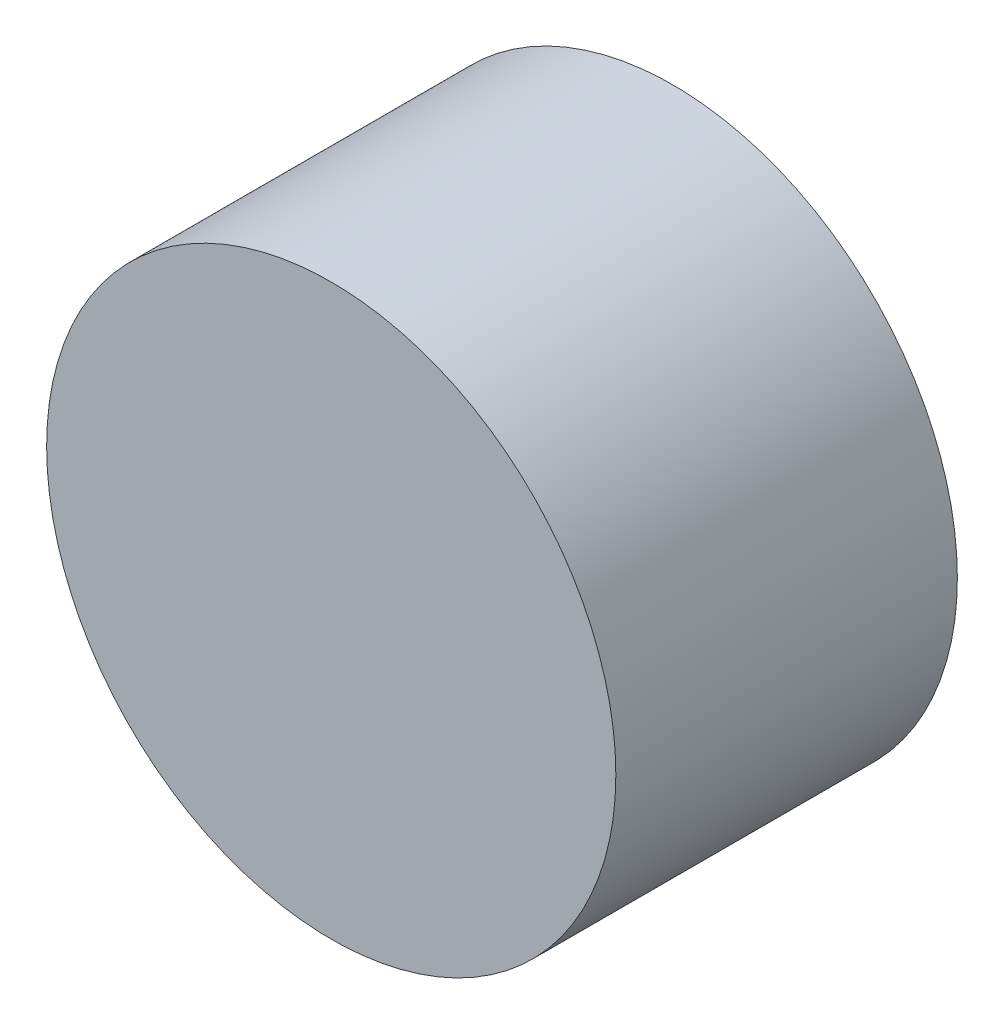
ISO-10303-21;
HEADER;
FILE_DESCRIPTION(('STEP AP214'),'2;1');
FILE_NAME('part.step','',(''),(''),'','','');
FILE_SCHEMA(('AUTOMOTIVE_DESIGN { 1 0 10303 214 1 1 1 1 }'));
ENDSEC;
DATA;
#1=APPLICATION_CONTEXT('core data for automotive mechanical design processes');
#2=APPLICATION_PROTOCOL_DEFINITION('international standard','automotive_design',2000,#1);
#3=PRODUCT_CONTEXT('',#1,'mechanical');
#4=PRODUCT('Part','Part','',(#3));
#5=PRODUCT_RELATED_PRODUCT_CATEGORY('part','',(#4));
#6=PRODUCT_DEFINITION_FORMATION('','',#4);
#7=PRODUCT_DEFINITION_CONTEXT('part definition',#1,'design');
#8=PRODUCT_DEFINITION('design','',#6,#7);
#9=PRODUCT_DEFINITION_SHAPE('','',#8);
#10=(LENGTH_UNIT() NAMED_UNIT(*) SI_UNIT(.MILLI.,.METRE.));
#11=(NAMED_UNIT(*) PLANE_ANGLE_UNIT() SI_UNIT($,.RADIAN.));
#12=(NAMED_UNIT(*) SI_UNIT($,.STERADIAN.) SOLID_ANGLE_UNIT());
#13=UNCERTAINTY_MEASURE_WITH_UNIT(LENGTH_MEASURE(1.E-05),#10,'distance_accuracy_value','');
#14=(GEOMETRIC_REPRESENTATION_CONTEXT(3) GLOBAL_UNCERTAINTY_ASSIGNED_CONTEXT((#13)) GLOBAL_UNIT_ASSIGNED_CONTEXT((#10,
#11,#12)) REPRESENTATION_CONTEXT('',''));
#15=CARTESIAN_POINT('',(0.,0.,0.));
#16=DIRECTION('',(0.,0.,1.));
#17=DIRECTION('',(1.,0.,0.));
#18=AXIS2_PLACEMENT_3D('',#15,#16,#17);
#19=CARTESIAN_POINT('',(-24.6,10.8442308309434,-3.));
#20=DIRECTION('',(0.,0.,1.));
#21=DIRECTION('',(1.,0.,0.));
#22=AXIS2_PLACEMENT_3D('',#19,#20,#21);
#23=CYLINDRICAL_SURFACE('',#22,2.5);
#24=CARTESIAN_POINT('',(-24.6,10.8442308309434,-3.));
#25=DIRECTION('',(0.,0.,1.));
#26=DIRECTION('',(1.,0.,0.));
#27=AXIS2_PLACEMENT_3D('',#24,#25,#26);
#28=CIRCLE('',#27,2.5);
#29=CARTESIAN_POINT('',(-22.1,10.8442308309434,-3.));
#30=VERTEX_POINT('',#29);
#31=EDGE_CURVE('E10',#30,#30,#28,.T.);
#32=ORIENTED_EDGE('',*,*,#31,.T.);
#33=EDGE_LOOP('',(#32));
#34=FACE_BOUND('',#33,.T.);
#35=CARTESIAN_POINT('',(-24.6,10.8442308309434,0.));
#36=DIRECTION('',(0.,0.,1.));
#37=DIRECTION('',(1.,0.,0.));
#38=AXIS2_PLACEMENT_3D('',#35,#36,#37);
#39=CIRCLE('',#38,2.5);
#40=CARTESIAN_POINT('',(-22.1,10.8442308309434,0.));
#41=VERTEX_POINT('',#40);
#42=EDGE_CURVE('E34',#41,#41,#39,.T.);
#43=ORIENTED_EDGE('',*,*,#42,.F.);
#44=EDGE_LOOP('',(#43));
#45=FACE_BOUND('',#44,.T.);
#46=ADVANCED_FACE('F31',(#34,#45),#23,.T.);
#47=CARTESIAN_POINT('',(-24.6,10.8442308309434,-3.));
#48=DIRECTION('',(0.,0.,1.));
#49=DIRECTION('',(1.,0.,0.));
#50=AXIS2_PLACEMENT_3D('',#47,#48,#49);
#51=PLANE('',#50);
#52=ORIENTED_EDGE('',*,*,#31,.F.);
#53=EDGE_LOOP('',(#52));
#54=FACE_BOUND('',#53,.T.);
#55=ADVANCED_FACE('F46',(#54),#51,.F.);
#56=CARTESIAN_POINT('',(-24.6,10.8442308309434,0.));
#57=DIRECTION('',(0.,0.,1.));
#58=DIRECTION('',(1.,0.,0.));
#59=AXIS2_PLACEMENT_3D('',#56,#57,#58);
#60=PLANE('',#59);
#61=ORIENTED_EDGE('',*,*,#42,.T.);
#62=EDGE_LOOP('',(#61));
#63=FACE_BOUND('',#62,.T.);
#64=ADVANCED_FACE('F43',(#63),#60,.T.);
#65=CLOSED_SHELL('',(#46,#55,#64));
#66=MANIFOLD_SOLID_BREP('B2',#65);
#67=ADVANCED_BREP_SHAPE_REPRESENTATION('',(#18,#66),#14);
#68=SHAPE_DEFINITION_REPRESENTATION(#9,#67);
ENDSEC;
END-ISO-10303-21;
